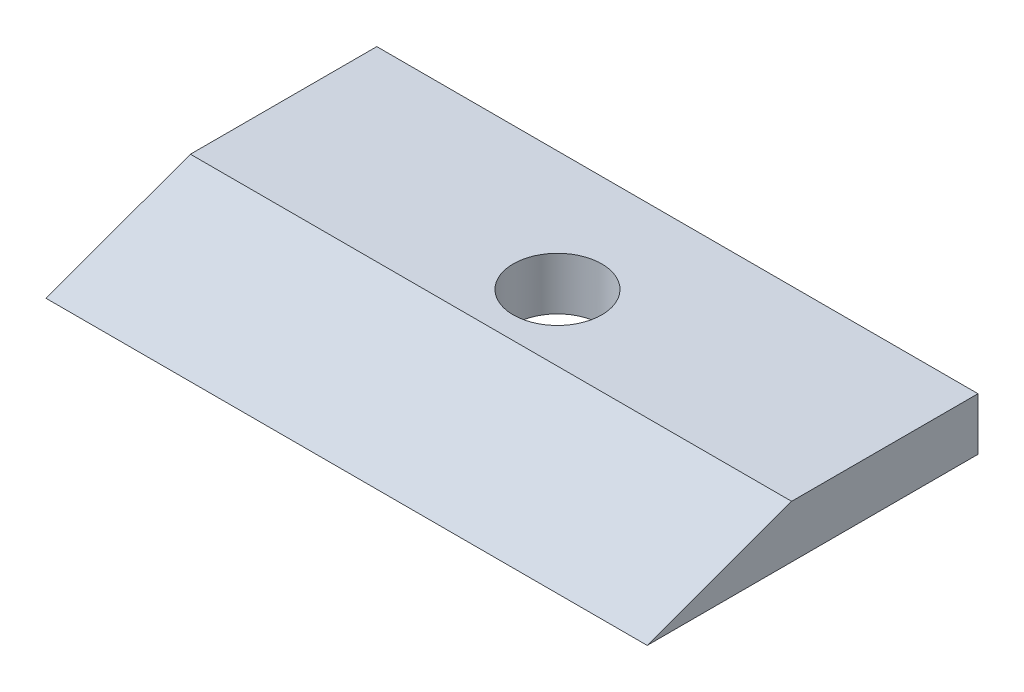
ISO-10303-21;
HEADER;
FILE_DESCRIPTION(('STEP AP214'),'2;1');
FILE_NAME('part.step','',(''),(''),'','','');
FILE_SCHEMA(('AUTOMOTIVE_DESIGN { 1 0 10303 214 1 1 1 1 }'));
ENDSEC;
DATA;
#1=APPLICATION_CONTEXT('core data for automotive mechanical design processes');
#2=APPLICATION_PROTOCOL_DEFINITION('international standard','automotive_design',2000,#1);
#3=PRODUCT_CONTEXT('',#1,'mechanical');
#4=PRODUCT('Part','Part','',(#3));
#5=PRODUCT_RELATED_PRODUCT_CATEGORY('part','',(#4));
#6=PRODUCT_DEFINITION_FORMATION('','',#4);
#7=PRODUCT_DEFINITION_CONTEXT('part definition',#1,'design');
#8=PRODUCT_DEFINITION('design','',#6,#7);
#9=PRODUCT_DEFINITION_SHAPE('','',#8);
#10=(LENGTH_UNIT() NAMED_UNIT(*) SI_UNIT(.MILLI.,.METRE.));
#11=(NAMED_UNIT(*) PLANE_ANGLE_UNIT() SI_UNIT($,.RADIAN.));
#12=(NAMED_UNIT(*) SI_UNIT($,.STERADIAN.) SOLID_ANGLE_UNIT());
#13=UNCERTAINTY_MEASURE_WITH_UNIT(LENGTH_MEASURE(1.E-05),#10,'distance_accuracy_value','');
#14=(GEOMETRIC_REPRESENTATION_CONTEXT(3) GLOBAL_UNCERTAINTY_ASSIGNED_CONTEXT((#13)) GLOBAL_UNIT_ASSIGNED_CONTEXT((#10,
#11,#12)) REPRESENTATION_CONTEXT('',''));
#15=CARTESIAN_POINT('',(0.,0.,0.));
#16=DIRECTION('',(0.,0.,1.));
#17=DIRECTION('',(1.,0.,0.));
#18=AXIS2_PLACEMENT_3D('',#15,#16,#17);
#19=CARTESIAN_POINT('',(36.35,0.00499999999999806,-20.0000000000001));
#20=DIRECTION('',(0.,0.999999968750001,0.000249999992187512));
#21=DIRECTION('',(0.,-0.000249999992187512,0.999999968750003));
#22=AXIS2_PLACEMENT_3D('',#19,#20,#21);
#23=PLANE('',#22);
#24=CARTESIAN_POINT('',(18.175,0.00318749999998758,-12.7500000000001));
#25=DIRECTION('',(0.,0.999999968750001,0.000249999992187512));
#26=DIRECTION('',(0.,0.000249999992187512,-0.999999968750003));
#27=AXIS2_PLACEMENT_3D('',#24,#25,#26);
#28=ELLIPSE('',#27,2.67500008359375,2.675);
#29=CARTESIAN_POINT('',(18.175,0.00385624999998761,-15.4250000000001));
#30=VERTEX_POINT('',#29);
#31=EDGE_CURVE('E98',#30,#30,#28,.T.);
#32=ORIENTED_EDGE('',*,*,#31,.T.);
#33=EDGE_LOOP('',(#32));
#34=FACE_BOUND('',#33,.T.);
#35=DIRECTION('',(0.,0.000249999992187512,-0.999999968750003));
#36=VECTOR('',#35,1.);
#37=CARTESIAN_POINT('',(0.,0.00499999999999806,-20.0000000000001));
#38=LINE('',#37,#36);
#39=CARTESIAN_POINT('',(0.,0.,0.));
#40=VERTEX_POINT('',#39);
#41=CARTESIAN_POINT('',(0.,0.00499999999999806,-20.0000000000001));
#42=VERTEX_POINT('',#41);
#43=EDGE_CURVE('E95',#40,#42,#38,.T.);
#44=ORIENTED_EDGE('',*,*,#43,.T.);
#45=DIRECTION('',(-1.,0.,0.));
#46=VECTOR('',#45,1.);
#47=CARTESIAN_POINT('',(36.35,0.00499999999999806,-20.0000000000001));
#48=LINE('',#47,#46);
#49=CARTESIAN_POINT('',(36.35,0.00499999999999806,-20.0000000000001));
#50=VERTEX_POINT('',#49);
#51=EDGE_CURVE('E11',#50,#42,#48,.T.);
#52=ORIENTED_EDGE('',*,*,#51,.F.);
#53=DIRECTION('',(0.,0.000249999992187512,-0.999999968750003));
#54=VECTOR('',#53,1.);
#55=CARTESIAN_POINT('',(36.35,0.00499999999999806,-20.0000000000001));
#56=LINE('',#55,#54);
#57=CARTESIAN_POINT('',(36.35,0.,0.));
#58=VERTEX_POINT('',#57);
#59=EDGE_CURVE('E83',#58,#50,#56,.T.);
#60=ORIENTED_EDGE('',*,*,#59,.F.);
#61=DIRECTION('',(-1.,0.,0.));
#62=VECTOR('',#61,1.);
#63=CARTESIAN_POINT('',(36.35,0.,0.));
#64=LINE('',#63,#62);
#65=EDGE_CURVE('E91',#58,#40,#64,.T.);
#66=ORIENTED_EDGE('',*,*,#65,.T.);
#67=EDGE_LOOP('',(#44,#52,#60,#66));
#68=FACE_BOUND('',#67,.T.);
#69=ADVANCED_FACE('F32',(#34,#68),#23,.F.);
#70=CARTESIAN_POINT('',(36.35,3.18,-20.0000000000001));
#71=DIRECTION('',(0.,0.,1.));
#72=DIRECTION('',(1.,0.,0.));
#73=AXIS2_PLACEMENT_3D('',#70,#71,#72);
#74=PLANE('',#73);
#75=DIRECTION('',(0.,1.,0.));
#76=VECTOR('',#75,1.);
#77=CARTESIAN_POINT('',(0.,3.18,-20.0000000000001));
#78=LINE('',#77,#76);
#79=CARTESIAN_POINT('',(0.,3.18,-20.0000000000001));
#80=VERTEX_POINT('',#79);
#81=EDGE_CURVE('E87',#42,#80,#78,.T.);
#82=ORIENTED_EDGE('',*,*,#81,.T.);
#83=DIRECTION('',(-1.,0.,0.));
#84=VECTOR('',#83,1.);
#85=CARTESIAN_POINT('',(36.35,3.18,-20.0000000000001));
#86=LINE('',#85,#84);
#87=CARTESIAN_POINT('',(36.35,3.18,-20.0000000000001));
#88=VERTEX_POINT('',#87);
#89=EDGE_CURVE('E40',#88,#80,#86,.T.);
#90=ORIENTED_EDGE('',*,*,#89,.F.);
#91=DIRECTION('',(0.,1.,0.));
#92=VECTOR('',#91,1.);
#93=CARTESIAN_POINT('',(36.35,3.18,-20.0000000000001));
#94=LINE('',#93,#92);
#95=EDGE_CURVE('E78',#50,#88,#94,.T.);
#96=ORIENTED_EDGE('',*,*,#95,.F.);
#97=ORIENTED_EDGE('',*,*,#51,.T.);
#98=EDGE_LOOP('',(#82,#90,#96,#97));
#99=FACE_BOUND('',#98,.T.);
#100=ADVANCED_FACE('F86',(#99),#74,.F.);
#101=CARTESIAN_POINT('',(36.3500000000001,3.18,-8.73018669616211));
#102=DIRECTION('',(0.,-1.,0.));
#103=DIRECTION('',(0.,0.,-1.));
#104=AXIS2_PLACEMENT_3D('',#101,#102,#103);
#105=PLANE('',#104);
#106=CARTESIAN_POINT('',(18.175,3.17999999999999,-12.7500000000001));
#107=DIRECTION('',(0.,1.,0.));
#108=DIRECTION('',(0.,0.,1.));
#109=AXIS2_PLACEMENT_3D('',#106,#107,#108);
#110=CIRCLE('',#109,2.675);
#111=CARTESIAN_POINT('',(18.175,3.17999999999999,-10.0750000000001));
#112=VERTEX_POINT('',#111);
#113=EDGE_CURVE('E111',#112,#112,#110,.T.);
#114=ORIENTED_EDGE('',*,*,#113,.F.);
#115=EDGE_LOOP('',(#114));
#116=FACE_BOUND('',#115,.T.);
#117=DIRECTION('',(0.,0.,1.));
#118=VECTOR('',#117,1.);
#119=CARTESIAN_POINT('',(0.,3.18,-8.73018669616206));
#120=LINE('',#119,#118);
#121=CARTESIAN_POINT('',(0.,3.18,-8.73018669616206));
#122=VERTEX_POINT('',#121);
#123=EDGE_CURVE('E65',#80,#122,#120,.T.);
#124=ORIENTED_EDGE('',*,*,#123,.T.);
#125=DIRECTION('',(-1.,0.,0.));
#126=VECTOR('',#125,1.);
#127=CARTESIAN_POINT('',(36.3500000000001,3.18,-8.73018669616211));
#128=LINE('',#127,#126);
#129=CARTESIAN_POINT('',(36.3500000000001,3.18,-8.73018669616211));
#130=VERTEX_POINT('',#129);
#131=EDGE_CURVE('E88',#130,#122,#128,.T.);
#132=ORIENTED_EDGE('',*,*,#131,.F.);
#133=DIRECTION('',(0.,0.,1.));
#134=VECTOR('',#133,1.);
#135=CARTESIAN_POINT('',(36.3500000000001,3.18,-8.73018669616211));
#136=LINE('',#135,#134);
#137=EDGE_CURVE('E81',#88,#130,#136,.T.);
#138=ORIENTED_EDGE('',*,*,#137,.F.);
#139=ORIENTED_EDGE('',*,*,#89,.T.);
#140=EDGE_LOOP('',(#124,#132,#138,#139));
#141=FACE_BOUND('',#140,.T.);
#142=ADVANCED_FACE('F89',(#116,#141),#105,.F.);
#143=CARTESIAN_POINT('',(36.35,0.,0.));
#144=DIRECTION('',(0.,-0.939607086387358,-0.34225505578539));
#145=DIRECTION('',(0.,0.342255055785389,-0.93960708638736));
#146=AXIS2_PLACEMENT_3D('',#143,#144,#145);
#147=PLANE('',#146);
#148=DIRECTION('',(0.,-0.342255055785389,0.939607086387359));
#149=VECTOR('',#148,1.);
#150=CARTESIAN_POINT('',(0.,0.,0.));
#151=LINE('',#150,#149);
#152=EDGE_CURVE('E71',#122,#40,#151,.T.);
#153=ORIENTED_EDGE('',*,*,#152,.T.);
#154=ORIENTED_EDGE('',*,*,#65,.F.);
#155=DIRECTION('',(0.,-0.342255055785389,0.939607086387359));
#156=VECTOR('',#155,1.);
#157=CARTESIAN_POINT('',(36.35,0.,0.));
#158=LINE('',#157,#156);
#159=EDGE_CURVE('E48',#130,#58,#158,.T.);
#160=ORIENTED_EDGE('',*,*,#159,.F.);
#161=ORIENTED_EDGE('',*,*,#131,.T.);
#162=EDGE_LOOP('',(#153,#154,#160,#161));
#163=FACE_BOUND('',#162,.T.);
#164=ADVANCED_FACE('F103',(#163),#147,.F.);
#165=CARTESIAN_POINT('',(36.35,0.,0.));
#166=DIRECTION('',(1.,0.,0.));
#167=DIRECTION('',(0.,0.,-1.));
#168=AXIS2_PLACEMENT_3D('',#165,#166,#167);
#169=PLANE('',#168);
#170=ORIENTED_EDGE('',*,*,#59,.T.);
#171=ORIENTED_EDGE('',*,*,#95,.T.);
#172=ORIENTED_EDGE('',*,*,#137,.T.);
#173=ORIENTED_EDGE('',*,*,#159,.T.);
#174=EDGE_LOOP('',(#170,#171,#172,#173));
#175=FACE_BOUND('',#174,.T.);
#176=ADVANCED_FACE('F79',(#175),#169,.T.);
#177=CARTESIAN_POINT('',(0.,0.,0.));
#178=DIRECTION('',(1.,0.,0.));
#179=DIRECTION('',(0.,0.,-1.));
#180=AXIS2_PLACEMENT_3D('',#177,#178,#179);
#181=PLANE('',#180);
#182=ORIENTED_EDGE('',*,*,#43,.F.);
#183=ORIENTED_EDGE('',*,*,#152,.F.);
#184=ORIENTED_EDGE('',*,*,#123,.F.);
#185=ORIENTED_EDGE('',*,*,#81,.F.);
#186=EDGE_LOOP('',(#182,#183,#184,#185));
#187=FACE_BOUND('',#186,.T.);
#188=ADVANCED_FACE('F106',(#187),#181,.F.);
#189=CARTESIAN_POINT('',(18.175,-11.82,-12.7500000000001));
#190=DIRECTION('',(0.,1.,0.));
#191=DIRECTION('',(0.,0.,1.));
#192=AXIS2_PLACEMENT_3D('',#189,#190,#191);
#193=CYLINDRICAL_SURFACE('',#192,2.675);
#194=ORIENTED_EDGE('',*,*,#113,.T.);
#195=EDGE_LOOP('',(#194));
#196=FACE_BOUND('',#195,.T.);
#197=ORIENTED_EDGE('',*,*,#31,.F.);
#198=EDGE_LOOP('',(#197));
#199=FACE_BOUND('',#198,.T.);
#200=ADVANCED_FACE('F115',(#196,#199),#193,.F.);
#201=CLOSED_SHELL('',(#69,#100,#142,#164,#176,#188,#200));
#202=MANIFOLD_SOLID_BREP('B2',#201);
#203=ADVANCED_BREP_SHAPE_REPRESENTATION('',(#18,#202),#14);
#204=SHAPE_DEFINITION_REPRESENTATION(#9,#203);
ENDSEC;
END-ISO-10303-21;
